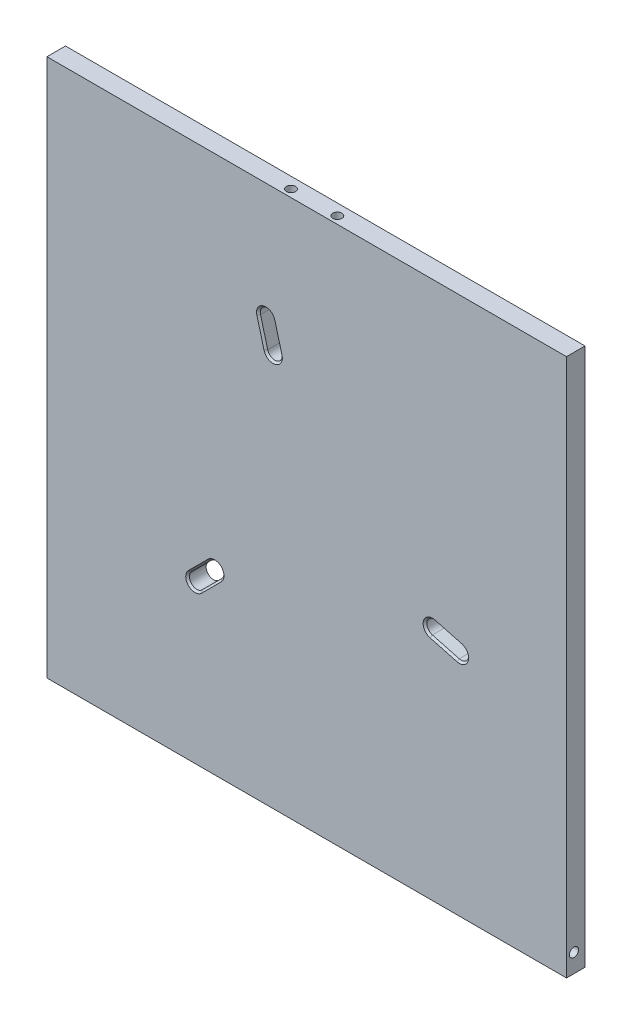
ISO-10303-21;
HEADER;
FILE_DESCRIPTION(('STEP AP214'),'2;1');
FILE_NAME('part.step','',(''),(''),'','','');
FILE_SCHEMA(('AUTOMOTIVE_DESIGN { 1 0 10303 214 1 1 1 1 }'));
ENDSEC;
DATA;
#1=APPLICATION_CONTEXT('core data for automotive mechanical design processes');
#2=APPLICATION_PROTOCOL_DEFINITION('international standard','automotive_design',2000,#1);
#3=PRODUCT_CONTEXT('',#1,'mechanical');
#4=PRODUCT('Part','Part','',(#3));
#5=PRODUCT_RELATED_PRODUCT_CATEGORY('part','',(#4));
#6=PRODUCT_DEFINITION_FORMATION('','',#4);
#7=PRODUCT_DEFINITION_CONTEXT('part definition',#1,'design');
#8=PRODUCT_DEFINITION('design','',#6,#7);
#9=PRODUCT_DEFINITION_SHAPE('','',#8);
#10=(LENGTH_UNIT() NAMED_UNIT(*) SI_UNIT(.MILLI.,.METRE.));
#11=(NAMED_UNIT(*) PLANE_ANGLE_UNIT() SI_UNIT($,.RADIAN.));
#12=(NAMED_UNIT(*) SI_UNIT($,.STERADIAN.) SOLID_ANGLE_UNIT());
#13=UNCERTAINTY_MEASURE_WITH_UNIT(LENGTH_MEASURE(1.E-05),#10,'distance_accuracy_value','');
#14=(GEOMETRIC_REPRESENTATION_CONTEXT(3) GLOBAL_UNCERTAINTY_ASSIGNED_CONTEXT((#13)) GLOBAL_UNIT_ASSIGNED_CONTEXT((#10,
#11,#12)) REPRESENTATION_CONTEXT('',''));
#15=CARTESIAN_POINT('',(0.,0.,0.));
#16=DIRECTION('',(0.,0.,1.));
#17=DIRECTION('',(1.,0.,0.));
#18=AXIS2_PLACEMENT_3D('',#15,#16,#17);
#19=CARTESIAN_POINT('',(0.,0.,0.));
#20=DIRECTION('',(0.,0.,1.));
#21=DIRECTION('',(1.,0.,0.));
#22=AXIS2_PLACEMENT_3D('',#19,#20,#21);
#23=PLANE('',#22);
#24=DIRECTION('',(-0.258819045102521,0.965925826289068,0.));
#25=VECTOR('',#24,1.);
#26=CARTESIAN_POINT('',(-7.15496283014528,42.1574980289941,0.));
#27=LINE('',#26,#25);
#28=CARTESIAN_POINT('',(-14.291343288909,68.7908324832421,0.));
#29=VERTEX_POINT('',#28);
#30=CARTESIAN_POINT('',(-18.1736289654468,83.2797198775781,0.));
#31=VERTEX_POINT('',#30);
#32=EDGE_CURVE('E332',#29,#31,#27,.T.);
#33=ORIENTED_EDGE('',*,*,#32,.T.);
#34=CARTESIAN_POINT('',(-22.0373322706031,82.244443697168,0.));
#35=DIRECTION('',(0.,0.,1.));
#36=DIRECTION('',(0.965925826289068,0.25881904510252,0.));
#37=AXIS2_PLACEMENT_3D('',#34,#35,#36);
#38=CIRCLE('',#37,4.);
#39=CARTESIAN_POINT('',(-25.9010355757594,81.2091675167579,0.));
#40=VERTEX_POINT('',#39);
#41=EDGE_CURVE('E336',#31,#40,#38,.T.);
#42=ORIENTED_EDGE('',*,*,#41,.T.);
#43=DIRECTION('',(0.258819045102521,-0.965925826289068,0.));
#44=VECTOR('',#43,1.);
#45=CARTESIAN_POINT('',(-12.9412266021889,32.8425019710059,0.));
#46=LINE('',#45,#44);
#47=CARTESIAN_POINT('',(-22.0187498992216,66.7202801224219,0.));
#48=VERTEX_POINT('',#47);
#49=EDGE_CURVE('E21',#40,#48,#46,.T.);
#50=ORIENTED_EDGE('',*,*,#49,.T.);
#51=CARTESIAN_POINT('',(-18.1550465940653,67.755556302832,0.));
#52=DIRECTION('',(0.,0.,1.));
#53=DIRECTION('',(-0.965925826289068,-0.258819045102521,0.));
#54=AXIS2_PLACEMENT_3D('',#51,#52,#53);
#55=CIRCLE('',#54,4.);
#56=EDGE_CURVE('E278',#48,#29,#55,.T.);
#57=ORIENTED_EDGE('',*,*,#56,.T.);
#58=EDGE_LOOP('',(#33,#42,#50,#57));
#59=FACE_BOUND('',#58,.T.);
#60=DIRECTION('',(-0.707106781186547,-0.707106781186548,0.));
#61=VECTOR('',#60,1.);
#62=CARTESIAN_POINT('',(-32.9319828380286,-27.2751285885362,0.));
#63=LINE('',#62,#61);
#64=CARTESIAN_POINT('',(-52.4289368335129,-46.7720825840205,0.));
#65=VERTEX_POINT('',#64);
#66=CARTESIAN_POINT('',(-63.0355385513111,-57.3786843018187,0.));
#67=VERTEX_POINT('',#66);
#68=EDGE_CURVE('E321',#65,#67,#63,.T.);
#69=ORIENTED_EDGE('',*,*,#68,.T.);
#70=CARTESIAN_POINT('',(-60.2071114265649,-60.2071114265649,0.));
#71=DIRECTION('',(0.,0.,1.));
#72=DIRECTION('',(-0.707106781186547,0.707106781186548,0.));
#73=AXIS2_PLACEMENT_3D('',#70,#71,#72);
#74=CIRCLE('',#73,4.);
#75=CARTESIAN_POINT('',(-57.3786843018187,-63.0355385513111,0.));
#76=VERTEX_POINT('',#75);
#77=EDGE_CURVE('E312',#67,#76,#74,.T.);
#78=ORIENTED_EDGE('',*,*,#77,.T.);
#79=DIRECTION('',(0.707106781186547,0.707106781186548,0.));
#80=VECTOR('',#79,1.);
#81=CARTESIAN_POINT('',(-21.9718277296372,-27.6286819791295,0.));
#82=LINE('',#81,#80);
#83=CARTESIAN_POINT('',(-46.7720825840205,-52.4289368335129,0.));
#84=VERTEX_POINT('',#83);
#85=EDGE_CURVE('E348',#76,#84,#82,.T.);
#86=ORIENTED_EDGE('',*,*,#85,.T.);
#87=CARTESIAN_POINT('',(-49.6005097087667,-49.6005097087667,0.));
#88=DIRECTION('',(0.,0.,1.));
#89=DIRECTION('',(0.707106781186548,-0.707106781186547,0.));
#90=AXIS2_PLACEMENT_3D('',#87,#88,#89);
#91=CIRCLE('',#90,4.);
#92=EDGE_CURVE('E358',#84,#65,#91,.T.);
#93=ORIENTED_EDGE('',*,*,#92,.T.);
#94=EDGE_LOOP('',(#69,#78,#86,#93));
#95=FACE_BOUND('',#94,.T.);
#96=DIRECTION('',(0.965925826289068,-0.258819045102521,0.));
#97=VECTOR('',#96,1.);
#98=CARTESIAN_POINT('',(40.0869456681739,-14.8823694404579,0.));
#99=LINE('',#98,#97);
#100=CARTESIAN_POINT('',(66.7202801224219,-22.0187498992216,0.));
#101=VERTEX_POINT('',#100);
#102=CARTESIAN_POINT('',(81.2091675167579,-25.9010355757594,0.));
#103=VERTEX_POINT('',#102);
#104=EDGE_CURVE('E150',#101,#103,#99,.T.);
#105=ORIENTED_EDGE('',*,*,#104,.T.);
#106=CARTESIAN_POINT('',(82.244443697168,-22.0373322706031,0.));
#107=DIRECTION('',(0.,0.,1.));
#108=DIRECTION('',(-0.258819045102522,-0.965925826289068,0.));
#109=AXIS2_PLACEMENT_3D('',#106,#107,#108);
#110=CIRCLE('',#109,4.);
#111=CARTESIAN_POINT('',(83.2797198775781,-18.1736289654469,0.));
#112=VERTEX_POINT('',#111);
#113=EDGE_CURVE('E164',#103,#112,#110,.T.);
#114=ORIENTED_EDGE('',*,*,#113,.T.);
#115=DIRECTION('',(-0.965925826289068,0.258819045102521,0.));
#116=VECTOR('',#115,1.);
#117=CARTESIAN_POINT('',(34.9130543318261,-5.2138199918764,0.));
#118=LINE('',#117,#116);
#119=CARTESIAN_POINT('',(68.7908324832421,-14.291343288909,0.));
#120=VERTEX_POINT('',#119);
#121=EDGE_CURVE('E367',#112,#120,#118,.T.);
#122=ORIENTED_EDGE('',*,*,#121,.T.);
#123=CARTESIAN_POINT('',(67.755556302832,-18.1550465940653,0.));
#124=DIRECTION('',(0.,0.,1.));
#125=DIRECTION('',(0.258819045102521,0.965925826289068,0.));
#126=AXIS2_PLACEMENT_3D('',#123,#124,#125);
#127=CIRCLE('',#126,4.);
#128=EDGE_CURVE('E602',#120,#101,#127,.T.);
#129=ORIENTED_EDGE('',*,*,#128,.T.);
#130=EDGE_LOOP('',(#105,#114,#122,#129));
#131=FACE_BOUND('',#130,.T.);
#132=DIRECTION('',(1.,0.,0.));
#133=VECTOR('',#132,1.);
#134=CARTESIAN_POINT('',(-140.,145.,0.));
#135=LINE('',#134,#133);
#136=CARTESIAN_POINT('',(-140.,145.,0.));
#137=VERTEX_POINT('',#136);
#138=CARTESIAN_POINT('',(140.,145.,0.));
#139=VERTEX_POINT('',#138);
#140=EDGE_CURVE('E11',#137,#139,#135,.T.);
#141=ORIENTED_EDGE('',*,*,#140,.T.);
#142=DIRECTION('',(0.,-1.,0.));
#143=VECTOR('',#142,1.);
#144=CARTESIAN_POINT('',(140.,145.,0.));
#145=LINE('',#144,#143);
#146=CARTESIAN_POINT('',(140.,-145.,0.));
#147=VERTEX_POINT('',#146);
#148=EDGE_CURVE('E435',#139,#147,#145,.T.);
#149=ORIENTED_EDGE('',*,*,#148,.T.);
#150=DIRECTION('',(-1.,0.,0.));
#151=VECTOR('',#150,1.);
#152=CARTESIAN_POINT('',(140.,-145.,0.));
#153=LINE('',#152,#151);
#154=CARTESIAN_POINT('',(-140.,-145.,0.));
#155=VERTEX_POINT('',#154);
#156=EDGE_CURVE('E445',#147,#155,#153,.T.);
#157=ORIENTED_EDGE('',*,*,#156,.T.);
#158=DIRECTION('',(0.,1.,0.));
#159=VECTOR('',#158,1.);
#160=CARTESIAN_POINT('',(-140.,-145.,0.));
#161=LINE('',#160,#159);
#162=EDGE_CURVE('E50',#155,#137,#161,.T.);
#163=ORIENTED_EDGE('',*,*,#162,.T.);
#164=EDGE_LOOP('',(#141,#149,#157,#163));
#165=FACE_BOUND('',#164,.T.);
#166=ADVANCED_FACE('F17',(#59,#95,#131,#165),#23,.F.);
#167=CARTESIAN_POINT('',(140.,145.,0.));
#168=DIRECTION('',(0.,1.,0.));
#169=DIRECTION('',(1.,0.,0.));
#170=AXIS2_PLACEMENT_3D('',#167,#168,#169);
#171=PLANE('',#170);
#172=CARTESIAN_POINT('',(-12.5,145.,6.));
#173=DIRECTION('',(0.,-1.,0.));
#174=DIRECTION('',(1.,0.,0.));
#175=AXIS2_PLACEMENT_3D('',#172,#173,#174);
#176=CIRCLE('',#175,2.4585);
#177=CARTESIAN_POINT('',(-14.9585,145.,6.));
#178=VERTEX_POINT('',#177);
#179=EDGE_CURVE('E371',#178,#178,#176,.T.);
#180=ORIENTED_EDGE('',*,*,#179,.T.);
#181=EDGE_LOOP('',(#180));
#182=FACE_BOUND('',#181,.T.);
#183=CARTESIAN_POINT('',(12.5,145.,6.));
#184=DIRECTION('',(0.,-1.,0.));
#185=DIRECTION('',(1.,0.,0.));
#186=AXIS2_PLACEMENT_3D('',#183,#184,#185);
#187=CIRCLE('',#186,2.4585);
#188=CARTESIAN_POINT('',(10.0415,145.,6.));
#189=VERTEX_POINT('',#188);
#190=EDGE_CURVE('E372',#189,#189,#187,.T.);
#191=ORIENTED_EDGE('',*,*,#190,.T.);
#192=EDGE_LOOP('',(#191));
#193=FACE_BOUND('',#192,.T.);
#194=ORIENTED_EDGE('',*,*,#140,.F.);
#195=DIRECTION('',(0.,0.,1.));
#196=VECTOR('',#195,1.);
#197=CARTESIAN_POINT('',(-140.,145.,0.));
#198=LINE('',#197,#196);
#199=CARTESIAN_POINT('',(-140.,145.,10.));
#200=VERTEX_POINT('',#199);
#201=EDGE_CURVE('E27',#137,#200,#198,.T.);
#202=ORIENTED_EDGE('',*,*,#201,.T.);
#203=DIRECTION('',(-1.,0.,0.));
#204=VECTOR('',#203,1.);
#205=CARTESIAN_POINT('',(-140.,145.,10.));
#206=LINE('',#205,#204);
#207=CARTESIAN_POINT('',(140.,145.,10.));
#208=VERTEX_POINT('',#207);
#209=EDGE_CURVE('E343',#208,#200,#206,.T.);
#210=ORIENTED_EDGE('',*,*,#209,.F.);
#211=DIRECTION('',(0.,0.,1.));
#212=VECTOR('',#211,1.);
#213=CARTESIAN_POINT('',(140.,145.,0.));
#214=LINE('',#213,#212);
#215=EDGE_CURVE('E432',#139,#208,#214,.T.);
#216=ORIENTED_EDGE('',*,*,#215,.F.);
#217=EDGE_LOOP('',(#194,#202,#210,#216));
#218=FACE_BOUND('',#217,.T.);
#219=ADVANCED_FACE('F649',(#182,#193,#218),#171,.T.);
#220=CARTESIAN_POINT('',(-140.,145.,0.));
#221=DIRECTION('',(-1.,0.,0.));
#222=DIRECTION('',(0.,0.,1.));
#223=AXIS2_PLACEMENT_3D('',#220,#221,#222);
#224=PLANE('',#223);
#225=CARTESIAN_POINT('',(-140.,-135.,6.));
#226=DIRECTION('',(1.,0.,0.));
#227=DIRECTION('',(0.,0.,-1.));
#228=AXIS2_PLACEMENT_3D('',#225,#226,#227);
#229=CIRCLE('',#228,2.4585);
#230=CARTESIAN_POINT('',(-140.,-135.,8.4585));
#231=VERTEX_POINT('',#230);
#232=EDGE_CURVE('E399',#231,#231,#229,.T.);
#233=ORIENTED_EDGE('',*,*,#232,.T.);
#234=EDGE_LOOP('',(#233));
#235=FACE_BOUND('',#234,.T.);
#236=ORIENTED_EDGE('',*,*,#162,.F.);
#237=DIRECTION('',(0.,0.,1.));
#238=VECTOR('',#237,1.);
#239=CARTESIAN_POINT('',(-140.,-145.,0.));
#240=LINE('',#239,#238);
#241=CARTESIAN_POINT('',(-140.,-145.,10.));
#242=VERTEX_POINT('',#241);
#243=EDGE_CURVE('E437',#155,#242,#240,.T.);
#244=ORIENTED_EDGE('',*,*,#243,.T.);
#245=DIRECTION('',(0.,-1.,0.));
#246=VECTOR('',#245,1.);
#247=CARTESIAN_POINT('',(-140.,-145.,10.));
#248=LINE('',#247,#246);
#249=EDGE_CURVE('E338',#200,#242,#248,.T.);
#250=ORIENTED_EDGE('',*,*,#249,.F.);
#251=ORIENTED_EDGE('',*,*,#201,.F.);
#252=EDGE_LOOP('',(#236,#244,#250,#251));
#253=FACE_BOUND('',#252,.T.);
#254=ADVANCED_FACE('F651',(#235,#253),#224,.T.);
#255=CARTESIAN_POINT('',(-140.,-145.,0.));
#256=DIRECTION('',(0.,-1.,0.));
#257=DIRECTION('',(0.,0.,-1.));
#258=AXIS2_PLACEMENT_3D('',#255,#256,#257);
#259=PLANE('',#258);
#260=ORIENTED_EDGE('',*,*,#156,.F.);
#261=DIRECTION('',(0.,0.,1.));
#262=VECTOR('',#261,1.);
#263=CARTESIAN_POINT('',(140.,-145.,0.));
#264=LINE('',#263,#262);
#265=CARTESIAN_POINT('',(140.,-145.,10.));
#266=VERTEX_POINT('',#265);
#267=EDGE_CURVE('E434',#147,#266,#264,.T.);
#268=ORIENTED_EDGE('',*,*,#267,.T.);
#269=DIRECTION('',(1.,0.,0.));
#270=VECTOR('',#269,1.);
#271=CARTESIAN_POINT('',(140.,-145.,10.));
#272=LINE('',#271,#270);
#273=EDGE_CURVE('E342',#242,#266,#272,.T.);
#274=ORIENTED_EDGE('',*,*,#273,.F.);
#275=ORIENTED_EDGE('',*,*,#243,.F.);
#276=EDGE_LOOP('',(#260,#268,#274,#275));
#277=FACE_BOUND('',#276,.T.);
#278=ADVANCED_FACE('F659',(#277),#259,.T.);
#279=CARTESIAN_POINT('',(140.,-145.,0.));
#280=DIRECTION('',(1.,0.,0.));
#281=DIRECTION('',(0.,1.,0.));
#282=AXIS2_PLACEMENT_3D('',#279,#280,#281);
#283=PLANE('',#282);
#284=CARTESIAN_POINT('',(140.,-135.,6.));
#285=DIRECTION('',(-1.,0.,0.));
#286=DIRECTION('',(0.,0.,-1.));
#287=AXIS2_PLACEMENT_3D('',#284,#285,#286);
#288=CIRCLE('',#287,2.4585);
#289=CARTESIAN_POINT('',(140.,-135.,8.4585));
#290=VERTEX_POINT('',#289);
#291=EDGE_CURVE('E381',#290,#290,#288,.T.);
#292=ORIENTED_EDGE('',*,*,#291,.T.);
#293=EDGE_LOOP('',(#292));
#294=FACE_BOUND('',#293,.T.);
#295=ORIENTED_EDGE('',*,*,#148,.F.);
#296=ORIENTED_EDGE('',*,*,#215,.T.);
#297=DIRECTION('',(0.,1.,0.));
#298=VECTOR('',#297,1.);
#299=CARTESIAN_POINT('',(140.,145.,10.));
#300=LINE('',#299,#298);
#301=EDGE_CURVE('E598',#266,#208,#300,.T.);
#302=ORIENTED_EDGE('',*,*,#301,.F.);
#303=ORIENTED_EDGE('',*,*,#267,.F.);
#304=EDGE_LOOP('',(#295,#296,#302,#303));
#305=FACE_BOUND('',#304,.T.);
#306=ADVANCED_FACE('F693',(#294,#305),#283,.T.);
#307=CARTESIAN_POINT('',(-22.0373322706031,82.244443697168,10.));
#308=DIRECTION('',(0.,0.,-1.));
#309=DIRECTION('',(0.965925826289068,0.25881904510252,0.));
#310=AXIS2_PLACEMENT_3D('',#307,#308,#309);
#311=CYLINDRICAL_SURFACE('',#310,4.);
#312=CARTESIAN_POINT('',(-22.0373322706031,82.244443697168,9.));
#313=DIRECTION('',(0.,0.,-1.));
#314=DIRECTION('',(0.965925826289068,0.25881904510252,0.));
#315=AXIS2_PLACEMENT_3D('',#312,#313,#314);
#316=CIRCLE('',#315,4.);
#317=CARTESIAN_POINT('',(-25.9010355757594,81.2091675167579,9.));
#318=VERTEX_POINT('',#317);
#319=CARTESIAN_POINT('',(-18.1736289654468,83.2797198775781,9.));
#320=VERTEX_POINT('',#319);
#321=EDGE_CURVE('E501',#318,#320,#316,.T.);
#322=ORIENTED_EDGE('',*,*,#321,.F.);
#323=DIRECTION('',(0.,0.,-1.));
#324=VECTOR('',#323,1.);
#325=CARTESIAN_POINT('',(-25.9010355757594,81.2091675167579,10.));
#326=LINE('',#325,#324);
#327=EDGE_CURVE('E289',#318,#40,#326,.T.);
#328=ORIENTED_EDGE('',*,*,#327,.T.);
#329=ORIENTED_EDGE('',*,*,#41,.F.);
#330=DIRECTION('',(0.,0.,-1.));
#331=VECTOR('',#330,1.);
#332=CARTESIAN_POINT('',(-18.1736289654468,83.2797198775781,10.));
#333=LINE('',#332,#331);
#334=EDGE_CURVE('E337',#320,#31,#333,.T.);
#335=ORIENTED_EDGE('',*,*,#334,.F.);
#336=EDGE_LOOP('',(#322,#328,#329,#335));
#337=FACE_BOUND('',#336,.T.);
#338=ADVANCED_FACE('F698',(#337),#311,.F.);
#339=CARTESIAN_POINT('',(-18.1736289654468,83.2797198775781,10.));
#340=DIRECTION('',(0.965925826289068,0.258819045102521,0.));
#341=DIRECTION('',(0.,0.,-1.));
#342=AXIS2_PLACEMENT_3D('',#339,#340,#341);
#343=PLANE('',#342);
#344=DIRECTION('',(0.258819045102521,-0.965925826289068,0.));
#345=VECTOR('',#344,1.);
#346=CARTESIAN_POINT('',(-7.15496283014528,42.1574980289941,9.));
#347=LINE('',#346,#345);
#348=CARTESIAN_POINT('',(-14.291343288909,68.7908324832421,9.));
#349=VERTEX_POINT('',#348);
#350=EDGE_CURVE('E283',#320,#349,#347,.T.);
#351=ORIENTED_EDGE('',*,*,#350,.F.);
#352=ORIENTED_EDGE('',*,*,#334,.T.);
#353=ORIENTED_EDGE('',*,*,#32,.F.);
#354=DIRECTION('',(0.,0.,-1.));
#355=VECTOR('',#354,1.);
#356=CARTESIAN_POINT('',(-14.291343288909,68.7908324832421,10.));
#357=LINE('',#356,#355);
#358=EDGE_CURVE('E429',#349,#29,#357,.T.);
#359=ORIENTED_EDGE('',*,*,#358,.F.);
#360=EDGE_LOOP('',(#351,#352,#353,#359));
#361=FACE_BOUND('',#360,.T.);
#362=ADVANCED_FACE('F812',(#361),#343,.F.);
#363=CARTESIAN_POINT('',(-18.1550465940653,67.755556302832,10.));
#364=DIRECTION('',(0.,0.,-1.));
#365=DIRECTION('',(-0.965925826289068,-0.258819045102521,0.));
#366=AXIS2_PLACEMENT_3D('',#363,#364,#365);
#367=CYLINDRICAL_SURFACE('',#366,4.);
#368=CARTESIAN_POINT('',(-18.1550465940653,67.755556302832,9.));
#369=DIRECTION('',(0.,0.,-1.));
#370=DIRECTION('',(-0.965925826289068,-0.258819045102521,0.));
#371=AXIS2_PLACEMENT_3D('',#368,#369,#370);
#372=CIRCLE('',#371,4.);
#373=CARTESIAN_POINT('',(-22.0187498992216,66.7202801224219,9.));
#374=VERTEX_POINT('',#373);
#375=EDGE_CURVE('E275',#349,#374,#372,.T.);
#376=ORIENTED_EDGE('',*,*,#375,.F.);
#377=ORIENTED_EDGE('',*,*,#358,.T.);
#378=ORIENTED_EDGE('',*,*,#56,.F.);
#379=DIRECTION('',(0.,0.,-1.));
#380=VECTOR('',#379,1.);
#381=CARTESIAN_POINT('',(-22.0187498992216,66.7202801224219,10.));
#382=LINE('',#381,#380);
#383=EDGE_CURVE('E270',#374,#48,#382,.T.);
#384=ORIENTED_EDGE('',*,*,#383,.F.);
#385=EDGE_LOOP('',(#376,#377,#378,#384));
#386=FACE_BOUND('',#385,.T.);
#387=ADVANCED_FACE('F272',(#386),#367,.F.);
#388=CARTESIAN_POINT('',(-22.0187498992216,66.7202801224219,10.));
#389=DIRECTION('',(-0.965925826289068,-0.258819045102521,0.));
#390=DIRECTION('',(-0.258819045102521,0.965925826289068,0.));
#391=AXIS2_PLACEMENT_3D('',#388,#389,#390);
#392=PLANE('',#391);
#393=DIRECTION('',(-0.258819045102521,0.965925826289068,0.));
#394=VECTOR('',#393,1.);
#395=CARTESIAN_POINT('',(-12.9412266021889,32.8425019710059,9.));
#396=LINE('',#395,#394);
#397=EDGE_CURVE('E286',#374,#318,#396,.T.);
#398=ORIENTED_EDGE('',*,*,#397,.F.);
#399=ORIENTED_EDGE('',*,*,#383,.T.);
#400=ORIENTED_EDGE('',*,*,#49,.F.);
#401=ORIENTED_EDGE('',*,*,#327,.F.);
#402=EDGE_LOOP('',(#398,#399,#400,#401));
#403=FACE_BOUND('',#402,.T.);
#404=ADVANCED_FACE('F287',(#403),#392,.F.);
#405=CARTESIAN_POINT('',(-6.67199991700075,42.2869075515453,9.5));
#406=DIRECTION('',(-0.683012701892218,-0.183012701892219,0.707106781186549));
#407=DIRECTION('',(-0.258819045102521,0.965925826289068,0.));
#408=AXIS2_PLACEMENT_3D('',#405,#406,#407);
#409=PLANE('',#408);
#410=DIRECTION('',(-0.683012701892217,-0.183012701892223,-0.707106781186549));
#411=VECTOR('',#410,1.);
#412=CARTESIAN_POINT('',(-13.32541746262,69.0496515283446,10.));
#413=LINE('',#412,#411);
#414=CARTESIAN_POINT('',(-13.32541746262,69.0496515283446,10.));
#415=VERTEX_POINT('',#414);
#416=EDGE_CURVE('E304',#415,#349,#413,.T.);
#417=ORIENTED_EDGE('',*,*,#416,.F.);
#418=DIRECTION('',(-0.258819045102521,0.965925826289068,0.));
#419=VECTOR('',#418,1.);
#420=CARTESIAN_POINT('',(-6.18903700385621,42.4163170740966,10.));
#421=LINE('',#420,#419);
#422=CARTESIAN_POINT('',(-17.2077031391578,83.5385389226806,10.));
#423=VERTEX_POINT('',#422);
#424=EDGE_CURVE('E363',#415,#423,#421,.T.);
#425=ORIENTED_EDGE('',*,*,#424,.T.);
#426=DIRECTION('',(0.683012701892214,0.183012701892218,0.707106781186553));
#427=VECTOR('',#426,1.);
#428=CARTESIAN_POINT('',(-18.1736289654468,83.2797198775781,9.));
#429=LINE('',#428,#427);
#430=EDGE_CURVE('E296',#320,#423,#429,.T.);
#431=ORIENTED_EDGE('',*,*,#430,.F.);
#432=ORIENTED_EDGE('',*,*,#350,.T.);
#433=EDGE_LOOP('',(#417,#425,#431,#432));
#434=FACE_BOUND('',#433,.T.);
#435=ADVANCED_FACE('F672',(#434),#409,.T.);
#436=CARTESIAN_POINT('',(-22.0373322706031,82.244443697168,9.5));
#437=DIRECTION('',(0.,0.,1.));
#438=DIRECTION('',(0.965925826289068,0.25881904510252,0.));
#439=AXIS2_PLACEMENT_3D('',#436,#437,#438);
#440=CONICAL_SURFACE('',#439,4.5,0.785398163397445);
#441=ORIENTED_EDGE('',*,*,#430,.T.);
#442=CARTESIAN_POINT('',(-22.0373322706031,82.244443697168,10.));
#443=DIRECTION('',(0.,0.,1.));
#444=DIRECTION('',(0.965925826289068,0.25881904510252,0.));
#445=AXIS2_PLACEMENT_3D('',#442,#443,#444);
#446=CIRCLE('',#445,5.);
#447=CARTESIAN_POINT('',(-26.8669614020485,80.9503484716554,10.));
#448=VERTEX_POINT('',#447);
#449=EDGE_CURVE('E518',#423,#448,#446,.T.);
#450=ORIENTED_EDGE('',*,*,#449,.T.);
#451=DIRECTION('',(-0.683012701892219,-0.183012701892216,0.707106781186549));
#452=VECTOR('',#451,1.);
#453=CARTESIAN_POINT('',(-25.9010355757594,81.2091675167579,9.));
#454=LINE('',#453,#452);
#455=EDGE_CURVE('E297',#318,#448,#454,.T.);
#456=ORIENTED_EDGE('',*,*,#455,.F.);
#457=ORIENTED_EDGE('',*,*,#321,.T.);
#458=EDGE_LOOP('',(#441,#450,#456,#457));
#459=FACE_BOUND('',#458,.T.);
#460=ADVANCED_FACE('F553',(#459),#440,.F.);
#461=CARTESIAN_POINT('',(-13.4241895153334,32.7130924484547,9.5));
#462=DIRECTION('',(0.68301270189222,0.18301270189222,0.707106781186547));
#463=DIRECTION('',(0.258819045102522,-0.965925826289068,0.));
#464=AXIS2_PLACEMENT_3D('',#461,#462,#463);
#465=PLANE('',#464);
#466=ORIENTED_EDGE('',*,*,#455,.T.);
#467=DIRECTION('',(0.258819045102521,-0.965925826289068,0.));
#468=VECTOR('',#467,1.);
#469=CARTESIAN_POINT('',(-13.907152428478,32.5836829259034,10.));
#470=LINE('',#469,#468);
#471=CARTESIAN_POINT('',(-22.9846757255107,66.4614610773194,10.));
#472=VERTEX_POINT('',#471);
#473=EDGE_CURVE('E309',#448,#472,#470,.T.);
#474=ORIENTED_EDGE('',*,*,#473,.T.);
#475=DIRECTION('',(-0.683012701892224,-0.183012701892221,0.707106781186543));
#476=VECTOR('',#475,1.);
#477=CARTESIAN_POINT('',(-22.0187498992216,66.7202801224219,9.));
#478=LINE('',#477,#476);
#479=EDGE_CURVE('E302',#374,#472,#478,.T.);
#480=ORIENTED_EDGE('',*,*,#479,.F.);
#481=ORIENTED_EDGE('',*,*,#397,.T.);
#482=EDGE_LOOP('',(#466,#474,#480,#481));
#483=FACE_BOUND('',#482,.T.);
#484=ADVANCED_FACE('F307',(#483),#465,.T.);
#485=CARTESIAN_POINT('',(-18.1550465940653,67.755556302832,9.5));
#486=DIRECTION('',(0.,0.,1.));
#487=DIRECTION('',(-0.965925826289068,-0.258819045102521,0.));
#488=AXIS2_PLACEMENT_3D('',#485,#486,#487);
#489=CONICAL_SURFACE('',#488,4.5,0.78539816339745);
#490=ORIENTED_EDGE('',*,*,#479,.T.);
#491=CARTESIAN_POINT('',(-18.1550465940653,67.755556302832,10.));
#492=DIRECTION('',(0.,0.,1.));
#493=DIRECTION('',(-0.965925826289068,-0.258819045102521,0.));
#494=AXIS2_PLACEMENT_3D('',#491,#492,#493);
#495=CIRCLE('',#494,5.);
#496=EDGE_CURVE('E519',#472,#415,#495,.T.);
#497=ORIENTED_EDGE('',*,*,#496,.T.);
#498=ORIENTED_EDGE('',*,*,#416,.T.);
#499=ORIENTED_EDGE('',*,*,#375,.T.);
#500=EDGE_LOOP('',(#490,#497,#498,#499));
#501=FACE_BOUND('',#500,.T.);
#502=ADVANCED_FACE('F300',(#501),#489,.F.);
#503=CARTESIAN_POINT('',(-60.2071114265649,-60.2071114265649,10.));
#504=DIRECTION('',(0.,0.,-1.));
#505=DIRECTION('',(-0.707106781186547,0.707106781186548,0.));
#506=AXIS2_PLACEMENT_3D('',#503,#504,#505);
#507=CYLINDRICAL_SURFACE('',#506,4.);
#508=CARTESIAN_POINT('',(-60.2071114265649,-60.2071114265649,9.));
#509=DIRECTION('',(0.,0.,-1.));
#510=DIRECTION('',(-0.707106781186547,0.707106781186548,0.));
#511=AXIS2_PLACEMENT_3D('',#508,#509,#510);
#512=CIRCLE('',#511,4.);
#513=CARTESIAN_POINT('',(-57.3786843018187,-63.0355385513111,9.));
#514=VERTEX_POINT('',#513);
#515=CARTESIAN_POINT('',(-63.0355385513111,-57.3786843018187,9.));
#516=VERTEX_POINT('',#515);
#517=EDGE_CURVE('E531',#514,#516,#512,.T.);
#518=ORIENTED_EDGE('',*,*,#517,.F.);
#519=DIRECTION('',(0.,0.,-1.));
#520=VECTOR('',#519,1.);
#521=CARTESIAN_POINT('',(-57.3786843018187,-63.0355385513111,10.));
#522=LINE('',#521,#520);
#523=EDGE_CURVE('E353',#514,#76,#522,.T.);
#524=ORIENTED_EDGE('',*,*,#523,.T.);
#525=ORIENTED_EDGE('',*,*,#77,.F.);
#526=DIRECTION('',(0.,0.,-1.));
#527=VECTOR('',#526,1.);
#528=CARTESIAN_POINT('',(-63.0355385513111,-57.3786843018187,10.));
#529=LINE('',#528,#527);
#530=EDGE_CURVE('E542',#516,#67,#529,.T.);
#531=ORIENTED_EDGE('',*,*,#530,.F.);
#532=EDGE_LOOP('',(#518,#524,#525,#531));
#533=FACE_BOUND('',#532,.T.);
#534=ADVANCED_FACE('F19',(#533),#507,.F.);
#535=CARTESIAN_POINT('',(-63.0355385513111,-57.3786843018187,10.));
#536=DIRECTION('',(-0.707106781186548,0.707106781186547,0.));
#537=DIRECTION('',(0.,0.,1.));
#538=AXIS2_PLACEMENT_3D('',#535,#536,#537);
#539=PLANE('',#538);
#540=DIRECTION('',(0.707106781186547,0.707106781186548,0.));
#541=VECTOR('',#540,1.);
#542=CARTESIAN_POINT('',(-32.9319828380286,-27.2751285885362,9.));
#543=LINE('',#542,#541);
#544=CARTESIAN_POINT('',(-52.4289368335129,-46.7720825840205,9.));
#545=VERTEX_POINT('',#544);
#546=EDGE_CURVE('E349',#516,#545,#543,.T.);
#547=ORIENTED_EDGE('',*,*,#546,.F.);
#548=ORIENTED_EDGE('',*,*,#530,.T.);
#549=ORIENTED_EDGE('',*,*,#68,.F.);
#550=DIRECTION('',(0.,0.,-1.));
#551=VECTOR('',#550,1.);
#552=CARTESIAN_POINT('',(-52.4289368335129,-46.7720825840205,10.));
#553=LINE('',#552,#551);
#554=EDGE_CURVE('E354',#545,#65,#553,.T.);
#555=ORIENTED_EDGE('',*,*,#554,.F.);
#556=EDGE_LOOP('',(#547,#548,#549,#555));
#557=FACE_BOUND('',#556,.T.);
#558=ADVANCED_FACE('F729',(#557),#539,.F.);
#559=CARTESIAN_POINT('',(82.244443697168,-22.0373322706031,10.));
#560=DIRECTION('',(0.,0.,-1.));
#561=DIRECTION('',(-0.258819045102522,-0.965925826289068,0.));
#562=AXIS2_PLACEMENT_3D('',#559,#560,#561);
#563=CYLINDRICAL_SURFACE('',#562,4.);
#564=CARTESIAN_POINT('',(82.244443697168,-22.0373322706031,9.));
#565=DIRECTION('',(0.,0.,-1.));
#566=DIRECTION('',(-0.258819045102522,-0.965925826289068,0.));
#567=AXIS2_PLACEMENT_3D('',#564,#565,#566);
#568=CIRCLE('',#567,4.);
#569=CARTESIAN_POINT('',(83.2797198775781,-18.1736289654469,9.));
#570=VERTEX_POINT('',#569);
#571=CARTESIAN_POINT('',(81.2091675167579,-25.9010355757594,9.));
#572=VERTEX_POINT('',#571);
#573=EDGE_CURVE('E508',#570,#572,#568,.T.);
#574=ORIENTED_EDGE('',*,*,#573,.F.);
#575=DIRECTION('',(0.,0.,-1.));
#576=VECTOR('',#575,1.);
#577=CARTESIAN_POINT('',(83.2797198775781,-18.1736289654469,10.));
#578=LINE('',#577,#576);
#579=EDGE_CURVE('E364',#570,#112,#578,.T.);
#580=ORIENTED_EDGE('',*,*,#579,.T.);
#581=ORIENTED_EDGE('',*,*,#113,.F.);
#582=DIRECTION('',(0.,0.,-1.));
#583=VECTOR('',#582,1.);
#584=CARTESIAN_POINT('',(81.2091675167579,-25.9010355757594,10.));
#585=LINE('',#584,#583);
#586=EDGE_CURVE('E482',#572,#103,#585,.T.);
#587=ORIENTED_EDGE('',*,*,#586,.F.);
#588=EDGE_LOOP('',(#574,#580,#581,#587));
#589=FACE_BOUND('',#588,.T.);
#590=ADVANCED_FACE('F889',(#589),#563,.F.);
#591=CARTESIAN_POINT('',(81.2091675167579,-25.9010355757594,10.));
#592=DIRECTION('',(-0.258819045102521,-0.965925826289068,0.));
#593=DIRECTION('',(-0.965925826289068,0.258819045102521,0.));
#594=AXIS2_PLACEMENT_3D('',#591,#592,#593);
#595=PLANE('',#594);
#596=DIRECTION('',(-0.965925826289068,0.258819045102521,0.));
#597=VECTOR('',#596,1.);
#598=CARTESIAN_POINT('',(40.0869456681739,-14.8823694404579,9.));
#599=LINE('',#598,#597);
#600=CARTESIAN_POINT('',(66.7202801224219,-22.0187498992216,9.));
#601=VERTEX_POINT('',#600);
#602=EDGE_CURVE('E512',#572,#601,#599,.T.);
#603=ORIENTED_EDGE('',*,*,#602,.F.);
#604=ORIENTED_EDGE('',*,*,#586,.T.);
#605=ORIENTED_EDGE('',*,*,#104,.F.);
#606=DIRECTION('',(0.,0.,-1.));
#607=VECTOR('',#606,1.);
#608=CARTESIAN_POINT('',(66.7202801224219,-22.0187498992216,10.));
#609=LINE('',#608,#607);
#610=EDGE_CURVE('E366',#601,#101,#609,.T.);
#611=ORIENTED_EDGE('',*,*,#610,.F.);
#612=EDGE_LOOP('',(#603,#604,#605,#611));
#613=FACE_BOUND('',#612,.T.);
#614=ADVANCED_FACE('F690',(#613),#595,.F.);
#615=CARTESIAN_POINT('',(-49.6005097087667,-49.6005097087667,10.));
#616=DIRECTION('',(0.,0.,-1.));
#617=DIRECTION('',(0.707106781186548,-0.707106781186547,0.));
#618=AXIS2_PLACEMENT_3D('',#615,#616,#617);
#619=CYLINDRICAL_SURFACE('',#618,4.);
#620=CARTESIAN_POINT('',(-49.6005097087667,-49.6005097087667,9.));
#621=DIRECTION('',(0.,0.,-1.));
#622=DIRECTION('',(0.707106781186548,-0.707106781186547,0.));
#623=AXIS2_PLACEMENT_3D('',#620,#621,#622);
#624=CIRCLE('',#623,4.);
#625=CARTESIAN_POINT('',(-46.7720825840205,-52.4289368335129,9.));
#626=VERTEX_POINT('',#625);
#627=EDGE_CURVE('E392',#545,#626,#624,.T.);
#628=ORIENTED_EDGE('',*,*,#627,.F.);
#629=ORIENTED_EDGE('',*,*,#554,.T.);
#630=ORIENTED_EDGE('',*,*,#92,.F.);
#631=DIRECTION('',(0.,0.,-1.));
#632=VECTOR('',#631,1.);
#633=CARTESIAN_POINT('',(-46.7720825840205,-52.4289368335129,10.));
#634=LINE('',#633,#632);
#635=EDGE_CURVE('E344',#626,#84,#634,.T.);
#636=ORIENTED_EDGE('',*,*,#635,.F.);
#637=EDGE_LOOP('',(#628,#629,#630,#636));
#638=FACE_BOUND('',#637,.T.);
#639=ADVANCED_FACE('F687',(#638),#619,.F.);
#640=CARTESIAN_POINT('',(-46.7720825840205,-52.4289368335129,10.));
#641=DIRECTION('',(0.707106781186548,-0.707106781186547,0.));
#642=DIRECTION('',(0.,0.,-1.));
#643=AXIS2_PLACEMENT_3D('',#640,#641,#642);
#644=PLANE('',#643);
#645=DIRECTION('',(-0.707106781186547,-0.707106781186548,0.));
#646=VECTOR('',#645,1.);
#647=CARTESIAN_POINT('',(-21.9718277296372,-27.6286819791295,9.));
#648=LINE('',#647,#646);
#649=EDGE_CURVE('E486',#626,#514,#648,.T.);
#650=ORIENTED_EDGE('',*,*,#649,.F.);
#651=ORIENTED_EDGE('',*,*,#635,.T.);
#652=ORIENTED_EDGE('',*,*,#85,.F.);
#653=ORIENTED_EDGE('',*,*,#523,.F.);
#654=EDGE_LOOP('',(#650,#651,#652,#653));
#655=FACE_BOUND('',#654,.T.);
#656=ADVANCED_FACE('F689',(#655),#644,.F.);
#657=CARTESIAN_POINT('',(-33.2855362286219,-26.921575197943,9.5));
#658=DIRECTION('',(0.5,-0.5,0.707106781186547));
#659=DIRECTION('',(-0.707106781186548,-0.707106781186548,0.));
#660=AXIS2_PLACEMENT_3D('',#657,#658,#659);
#661=PLANE('',#660);
#662=DIRECTION('',(0.5,-0.5,-0.70710678118655));
#663=VECTOR('',#662,1.);
#664=CARTESIAN_POINT('',(-53.1360436146994,-46.064975802834,10.));
#665=LINE('',#664,#663);
#666=CARTESIAN_POINT('',(-53.1360436146994,-46.064975802834,10.));
#667=VERTEX_POINT('',#666);
#668=EDGE_CURVE('E362',#667,#545,#665,.T.);
#669=ORIENTED_EDGE('',*,*,#668,.F.);
#670=DIRECTION('',(-0.707106781186547,-0.707106781186548,0.));
#671=VECTOR('',#670,1.);
#672=CARTESIAN_POINT('',(-33.6390896192152,-26.5680218073497,10.));
#673=LINE('',#672,#671);
#674=CARTESIAN_POINT('',(-63.7426453324976,-56.6715775206322,10.));
#675=VERTEX_POINT('',#674);
#676=EDGE_CURVE('E563',#667,#675,#673,.T.);
#677=ORIENTED_EDGE('',*,*,#676,.T.);
#678=DIRECTION('',(-0.5,0.5,0.70710678118655));
#679=VECTOR('',#678,1.);
#680=CARTESIAN_POINT('',(-63.0355385513111,-57.3786843018187,9.));
#681=LINE('',#680,#679);
#682=EDGE_CURVE('E232',#516,#675,#681,.T.);
#683=ORIENTED_EDGE('',*,*,#682,.F.);
#684=ORIENTED_EDGE('',*,*,#546,.T.);
#685=EDGE_LOOP('',(#669,#677,#683,#684));
#686=FACE_BOUND('',#685,.T.);
#687=ADVANCED_FACE('F833',(#686),#661,.T.);
#688=CARTESIAN_POINT('',(-60.2071114265649,-60.2071114265649,9.5));
#689=DIRECTION('',(0.,0.,1.));
#690=DIRECTION('',(-0.707106781186547,0.707106781186548,0.));
#691=AXIS2_PLACEMENT_3D('',#688,#689,#690);
#692=CONICAL_SURFACE('',#691,4.5,0.785398163397448);
#693=ORIENTED_EDGE('',*,*,#682,.T.);
#694=CARTESIAN_POINT('',(-60.2071114265649,-60.2071114265649,10.));
#695=DIRECTION('',(0.,0.,1.));
#696=DIRECTION('',(-0.707106781186547,0.707106781186548,0.));
#697=AXIS2_PLACEMENT_3D('',#694,#695,#696);
#698=CIRCLE('',#697,5.);
#699=CARTESIAN_POINT('',(-56.6715775206322,-63.7426453324976,10.));
#700=VERTEX_POINT('',#699);
#701=EDGE_CURVE('E567',#675,#700,#698,.T.);
#702=ORIENTED_EDGE('',*,*,#701,.T.);
#703=DIRECTION('',(0.5,-0.5,0.707106781186546));
#704=VECTOR('',#703,1.);
#705=CARTESIAN_POINT('',(-57.3786843018187,-63.0355385513111,9.));
#706=LINE('',#705,#704);
#707=EDGE_CURVE('E244',#514,#700,#706,.T.);
#708=ORIENTED_EDGE('',*,*,#707,.F.);
#709=ORIENTED_EDGE('',*,*,#517,.T.);
#710=EDGE_LOOP('',(#693,#702,#708,#709));
#711=FACE_BOUND('',#710,.T.);
#712=ADVANCED_FACE('F827',(#711),#692,.F.);
#713=CARTESIAN_POINT('',(-21.6182743390439,-27.9822353697228,9.5));
#714=DIRECTION('',(-0.5,0.5,0.707106781186546));
#715=DIRECTION('',(0.707106781186548,0.707106781186548,0.));
#716=AXIS2_PLACEMENT_3D('',#713,#714,#715);
#717=PLANE('',#716);
#718=ORIENTED_EDGE('',*,*,#707,.T.);
#719=DIRECTION('',(0.707106781186547,0.707106781186548,0.));
#720=VECTOR('',#719,1.);
#721=CARTESIAN_POINT('',(-21.2647209484506,-28.3357887603161,10.));
#722=LINE('',#721,#720);
#723=CARTESIAN_POINT('',(-46.0649758028339,-53.1360436146994,10.));
#724=VERTEX_POINT('',#723);
#725=EDGE_CURVE('E575',#700,#724,#722,.T.);
#726=ORIENTED_EDGE('',*,*,#725,.T.);
#727=DIRECTION('',(0.5,-0.5,0.707106781186548));
#728=VECTOR('',#727,1.);
#729=CARTESIAN_POINT('',(-46.7720825840205,-52.4289368335129,9.));
#730=LINE('',#729,#728);
#731=EDGE_CURVE('E359',#626,#724,#730,.T.);
#732=ORIENTED_EDGE('',*,*,#731,.F.);
#733=ORIENTED_EDGE('',*,*,#649,.T.);
#734=EDGE_LOOP('',(#718,#726,#732,#733));
#735=FACE_BOUND('',#734,.T.);
#736=ADVANCED_FACE('F832',(#735),#717,.T.);
#737=CARTESIAN_POINT('',(-49.6005097087667,-49.6005097087667,9.5));
#738=DIRECTION('',(0.,0.,1.));
#739=DIRECTION('',(0.707106781186548,-0.707106781186547,0.));
#740=AXIS2_PLACEMENT_3D('',#737,#738,#739);
#741=CONICAL_SURFACE('',#740,4.5,0.785398163397448);
#742=ORIENTED_EDGE('',*,*,#731,.T.);
#743=CARTESIAN_POINT('',(-49.6005097087667,-49.6005097087667,10.));
#744=DIRECTION('',(0.,0.,1.));
#745=DIRECTION('',(0.707106781186548,-0.707106781186547,0.));
#746=AXIS2_PLACEMENT_3D('',#743,#744,#745);
#747=CIRCLE('',#746,5.);
#748=EDGE_CURVE('E615',#724,#667,#747,.T.);
#749=ORIENTED_EDGE('',*,*,#748,.T.);
#750=ORIENTED_EDGE('',*,*,#668,.T.);
#751=ORIENTED_EDGE('',*,*,#627,.T.);
#752=EDGE_LOOP('',(#742,#749,#750,#751));
#753=FACE_BOUND('',#752,.T.);
#754=ADVANCED_FACE('F842',(#753),#741,.F.);
#755=CARTESIAN_POINT('',(0.,0.,10.));
#756=DIRECTION('',(0.,0.,1.));
#757=DIRECTION('',(1.,0.,0.));
#758=AXIS2_PLACEMENT_3D('',#755,#756,#757);
#759=PLANE('',#758);
#760=CARTESIAN_POINT('',(67.755556302832,-18.1550465940653,10.));
#761=DIRECTION('',(0.,0.,1.));
#762=DIRECTION('',(0.258819045102521,0.965925826289068,0.));
#763=AXIS2_PLACEMENT_3D('',#760,#761,#762);
#764=CIRCLE('',#763,5.);
#765=CARTESIAN_POINT('',(69.0496515283446,-13.32541746262,10.));
#766=VERTEX_POINT('',#765);
#767=CARTESIAN_POINT('',(66.4614610773194,-22.9846757255107,10.));
#768=VERTEX_POINT('',#767);
#769=EDGE_CURVE('E386',#766,#768,#764,.T.);
#770=ORIENTED_EDGE('',*,*,#769,.F.);
#771=DIRECTION('',(-0.965925826289068,0.258819045102521,0.));
#772=VECTOR('',#771,1.);
#773=CARTESIAN_POINT('',(35.1718733769286,-4.24789416558733,10.));
#774=LINE('',#773,#772);
#775=CARTESIAN_POINT('',(83.5385389226806,-17.2077031391578,10.));
#776=VERTEX_POINT('',#775);
#777=EDGE_CURVE('E393',#776,#766,#774,.T.);
#778=ORIENTED_EDGE('',*,*,#777,.F.);
#779=CARTESIAN_POINT('',(82.244443697168,-22.0373322706031,10.));
#780=DIRECTION('',(0.,0.,1.));
#781=DIRECTION('',(-0.258819045102522,-0.965925826289068,0.));
#782=AXIS2_PLACEMENT_3D('',#779,#780,#781);
#783=CIRCLE('',#782,5.);
#784=CARTESIAN_POINT('',(80.9503484716554,-26.8669614020485,10.));
#785=VERTEX_POINT('',#784);
#786=EDGE_CURVE('E423',#785,#776,#783,.T.);
#787=ORIENTED_EDGE('',*,*,#786,.F.);
#788=DIRECTION('',(0.965925826289068,-0.258819045102521,0.));
#789=VECTOR('',#788,1.);
#790=CARTESIAN_POINT('',(39.8281266230714,-15.8482952667469,10.));
#791=LINE('',#790,#789);
#792=EDGE_CURVE('E516',#768,#785,#791,.T.);
#793=ORIENTED_EDGE('',*,*,#792,.F.);
#794=EDGE_LOOP('',(#770,#778,#787,#793));
#795=FACE_BOUND('',#794,.T.);
#796=ORIENTED_EDGE('',*,*,#496,.F.);
#797=ORIENTED_EDGE('',*,*,#473,.F.);
#798=ORIENTED_EDGE('',*,*,#449,.F.);
#799=ORIENTED_EDGE('',*,*,#424,.F.);
#800=EDGE_LOOP('',(#796,#797,#798,#799));
#801=FACE_BOUND('',#800,.T.);
#802=ORIENTED_EDGE('',*,*,#748,.F.);
#803=ORIENTED_EDGE('',*,*,#725,.F.);
#804=ORIENTED_EDGE('',*,*,#701,.F.);
#805=ORIENTED_EDGE('',*,*,#676,.F.);
#806=EDGE_LOOP('',(#802,#803,#804,#805));
#807=FACE_BOUND('',#806,.T.);
#808=ORIENTED_EDGE('',*,*,#209,.T.);
#809=ORIENTED_EDGE('',*,*,#249,.T.);
#810=ORIENTED_EDGE('',*,*,#273,.T.);
#811=ORIENTED_EDGE('',*,*,#301,.T.);
#812=EDGE_LOOP('',(#808,#809,#810,#811));
#813=FACE_BOUND('',#812,.T.);
#814=ADVANCED_FACE('F560',(#795,#801,#807,#813),#759,.T.);
#815=CARTESIAN_POINT('',(67.755556302832,-18.1550465940653,10.));
#816=DIRECTION('',(0.,0.,-1.));
#817=DIRECTION('',(0.258819045102521,0.965925826289068,0.));
#818=AXIS2_PLACEMENT_3D('',#815,#816,#817);
#819=CYLINDRICAL_SURFACE('',#818,4.);
#820=CARTESIAN_POINT('',(67.755556302832,-18.1550465940653,9.));
#821=DIRECTION('',(0.,0.,-1.));
#822=DIRECTION('',(0.258819045102521,0.965925826289068,0.));
#823=AXIS2_PLACEMENT_3D('',#820,#821,#822);
#824=CIRCLE('',#823,4.);
#825=CARTESIAN_POINT('',(68.7908324832421,-14.291343288909,9.));
#826=VERTEX_POINT('',#825);
#827=EDGE_CURVE('E457',#601,#826,#824,.T.);
#828=ORIENTED_EDGE('',*,*,#827,.F.);
#829=ORIENTED_EDGE('',*,*,#610,.T.);
#830=ORIENTED_EDGE('',*,*,#128,.F.);
#831=DIRECTION('',(0.,0.,-1.));
#832=VECTOR('',#831,1.);
#833=CARTESIAN_POINT('',(68.7908324832421,-14.291343288909,10.));
#834=LINE('',#833,#832);
#835=EDGE_CURVE('E500',#826,#120,#834,.T.);
#836=ORIENTED_EDGE('',*,*,#835,.F.);
#837=EDGE_LOOP('',(#828,#829,#830,#836));
#838=FACE_BOUND('',#837,.T.);
#839=ADVANCED_FACE('F682',(#838),#819,.F.);
#840=CARTESIAN_POINT('',(68.7908324832421,-14.291343288909,10.));
#841=DIRECTION('',(0.258819045102521,0.965925826289068,0.));
#842=DIRECTION('',(0.,0.,-1.));
#843=AXIS2_PLACEMENT_3D('',#840,#841,#842);
#844=PLANE('',#843);
#845=DIRECTION('',(0.965925826289068,-0.258819045102521,0.));
#846=VECTOR('',#845,1.);
#847=CARTESIAN_POINT('',(34.9130543318261,-5.2138199918764,9.));
#848=LINE('',#847,#846);
#849=EDGE_CURVE('E395',#826,#570,#848,.T.);
#850=ORIENTED_EDGE('',*,*,#849,.F.);
#851=ORIENTED_EDGE('',*,*,#835,.T.);
#852=ORIENTED_EDGE('',*,*,#121,.F.);
#853=ORIENTED_EDGE('',*,*,#579,.F.);
#854=EDGE_LOOP('',(#850,#851,#852,#853));
#855=FACE_BOUND('',#854,.T.);
#856=ADVANCED_FACE('F685',(#855),#844,.F.);
#857=CARTESIAN_POINT('',(39.9575361456227,-15.3653323536024,9.5));
#858=DIRECTION('',(0.18301270189222,0.683012701892221,0.707106781186546));
#859=DIRECTION('',(0.965925826289068,-0.258819045102521,0.));
#860=AXIS2_PLACEMENT_3D('',#857,#858,#859);
#861=PLANE('',#860);
#862=DIRECTION('',(0.183012701892216,0.683012701892219,-0.707106781186549));
#863=VECTOR('',#862,1.);
#864=CARTESIAN_POINT('',(66.4614610773194,-22.9846757255107,10.));
#865=LINE('',#864,#863);
#866=EDGE_CURVE('E454',#768,#601,#865,.T.);
#867=ORIENTED_EDGE('',*,*,#866,.F.);
#868=ORIENTED_EDGE('',*,*,#792,.T.);
#869=DIRECTION('',(-0.183012701892205,-0.683012701892216,0.707106781186554));
#870=VECTOR('',#869,1.);
#871=CARTESIAN_POINT('',(81.2091675167579,-25.9010355757594,9.));
#872=LINE('',#871,#870);
#873=EDGE_CURVE('E419',#572,#785,#872,.T.);
#874=ORIENTED_EDGE('',*,*,#873,.F.);
#875=ORIENTED_EDGE('',*,*,#602,.T.);
#876=EDGE_LOOP('',(#867,#868,#874,#875));
#877=FACE_BOUND('',#876,.T.);
#878=ADVANCED_FACE('F794',(#877),#861,.T.);
#879=CARTESIAN_POINT('',(82.244443697168,-22.0373322706031,9.5));
#880=DIRECTION('',(0.,0.,1.));
#881=DIRECTION('',(-0.258819045102522,-0.965925826289068,0.));
#882=AXIS2_PLACEMENT_3D('',#879,#880,#881);
#883=CONICAL_SURFACE('',#882,4.5,0.785398163397445);
#884=ORIENTED_EDGE('',*,*,#873,.T.);
#885=ORIENTED_EDGE('',*,*,#786,.T.);
#886=DIRECTION('',(0.183012701892229,0.683012701892216,0.707106781186549));
#887=VECTOR('',#886,1.);
#888=CARTESIAN_POINT('',(83.2797198775781,-18.1736289654469,9.));
#889=LINE('',#888,#887);
#890=EDGE_CURVE('E396',#570,#776,#889,.T.);
#891=ORIENTED_EDGE('',*,*,#890,.F.);
#892=ORIENTED_EDGE('',*,*,#573,.T.);
#893=EDGE_LOOP('',(#884,#885,#891,#892));
#894=FACE_BOUND('',#893,.T.);
#895=ADVANCED_FACE('F802',(#894),#883,.F.);
#896=CARTESIAN_POINT('',(35.0424638543773,-4.73085707873187,9.5));
#897=DIRECTION('',(-0.18301270189222,-0.683012701892221,0.707106781186546));
#898=DIRECTION('',(-0.965925826289068,0.258819045102521,0.));
#899=AXIS2_PLACEMENT_3D('',#896,#897,#898);
#900=PLANE('',#899);
#901=ORIENTED_EDGE('',*,*,#890,.T.);
#902=ORIENTED_EDGE('',*,*,#777,.T.);
#903=DIRECTION('',(0.183012701892221,0.683012701892223,0.707106781186544));
#904=VECTOR('',#903,1.);
#905=CARTESIAN_POINT('',(68.7908324832421,-14.291343288909,9.));
#906=LINE('',#905,#904);
#907=EDGE_CURVE('E383',#826,#766,#906,.T.);
#908=ORIENTED_EDGE('',*,*,#907,.F.);
#909=ORIENTED_EDGE('',*,*,#849,.T.);
#910=EDGE_LOOP('',(#901,#902,#908,#909));
#911=FACE_BOUND('',#910,.T.);
#912=ADVANCED_FACE('F821',(#911),#900,.T.);
#913=CARTESIAN_POINT('',(67.755556302832,-18.1550465940653,9.5));
#914=DIRECTION('',(0.,0.,1.));
#915=DIRECTION('',(0.258819045102521,0.965925826289068,0.));
#916=AXIS2_PLACEMENT_3D('',#913,#914,#915);
#917=CONICAL_SURFACE('',#916,4.5,0.785398163397449);
#918=ORIENTED_EDGE('',*,*,#907,.T.);
#919=ORIENTED_EDGE('',*,*,#769,.T.);
#920=ORIENTED_EDGE('',*,*,#866,.T.);
#921=ORIENTED_EDGE('',*,*,#827,.T.);
#922=EDGE_LOOP('',(#918,#919,#920,#921));
#923=FACE_BOUND('',#922,.T.);
#924=ADVANCED_FACE('F862',(#923),#917,.F.);
#925=CARTESIAN_POINT('',(132.5,-135.,6.));
#926=DIRECTION('',(1.,0.,0.));
#927=DIRECTION('',(0.,0.,-1.));
#928=AXIS2_PLACEMENT_3D('',#925,#926,#927);
#929=CYLINDRICAL_SURFACE('',#928,2.4585);
#930=ORIENTED_EDGE('',*,*,#291,.F.);
#931=DIRECTION('',(-1.,0.,0.));
#932=VECTOR('',#931,1.);
#933=CARTESIAN_POINT('',(132.5,-135.,8.4585));
#934=LINE('',#933,#932);
#935=CARTESIAN_POINT('',(125.,-135.,8.4585));
#936=VERTEX_POINT('',#935);
#937=EDGE_CURVE('E387',#290,#936,#934,.T.);
#938=ORIENTED_EDGE('',*,*,#937,.T.);
#939=CARTESIAN_POINT('',(125.,-135.,6.));
#940=DIRECTION('',(1.,0.,0.));
#941=DIRECTION('',(0.,0.,-1.));
#942=AXIS2_PLACEMENT_3D('',#939,#940,#941);
#943=CIRCLE('',#942,2.4585);
#944=EDGE_CURVE('E382',#936,#936,#943,.T.);
#945=ORIENTED_EDGE('',*,*,#944,.F.);
#946=ORIENTED_EDGE('',*,*,#937,.F.);
#947=EDGE_LOOP('',(#930,#938,#945,#946));
#948=FACE_BOUND('',#947,.T.);
#949=ADVANCED_FACE('F867',(#948),#929,.F.);
#950=CARTESIAN_POINT('',(124.26139208406,-135.,6.));
#951=DIRECTION('',(1.,0.,0.));
#952=DIRECTION('',(0.,0.,-1.));
#953=AXIS2_PLACEMENT_3D('',#950,#951,#952);
#954=CONICAL_SURFACE('',#953,1.22925,1.02974425867665);
#955=ORIENTED_EDGE('',*,*,#944,.T.);
#956=DIRECTION('',(-0.515038074910054,0.,-0.857167300702112));
#957=VECTOR('',#956,1.);
#958=CARTESIAN_POINT('',(124.26139208406,-135.,7.22925));
#959=LINE('',#958,#957);
#960=CARTESIAN_POINT('',(123.522784168121,-135.,6.));
#961=VERTEX_POINT('',#960);
#962=EDGE_CURVE('E378',#936,#961,#959,.T.);
#963=ORIENTED_EDGE('',*,*,#962,.T.);
#964=ORIENTED_EDGE('',*,*,#962,.F.);
#965=EDGE_LOOP('',(#955,#963,#964));
#966=FACE_BOUND('',#965,.T.);
#967=ADVANCED_FACE('F679',(#966),#954,.F.);
#968=CARTESIAN_POINT('',(-132.5,-135.,6.));
#969=DIRECTION('',(1.,0.,0.));
#970=DIRECTION('',(0.,0.,-1.));
#971=AXIS2_PLACEMENT_3D('',#968,#969,#970);
#972=CYLINDRICAL_SURFACE('',#971,2.4585);
#973=ORIENTED_EDGE('',*,*,#232,.F.);
#974=DIRECTION('',(1.,0.,0.));
#975=VECTOR('',#974,1.);
#976=CARTESIAN_POINT('',(-132.5,-135.,8.4585));
#977=LINE('',#976,#975);
#978=CARTESIAN_POINT('',(-125.,-135.,8.4585));
#979=VERTEX_POINT('',#978);
#980=EDGE_CURVE('E397',#231,#979,#977,.T.);
#981=ORIENTED_EDGE('',*,*,#980,.T.);
#982=CARTESIAN_POINT('',(-125.,-135.,6.));
#983=DIRECTION('',(1.,0.,0.));
#984=DIRECTION('',(0.,0.,-1.));
#985=AXIS2_PLACEMENT_3D('',#982,#983,#984);
#986=CIRCLE('',#985,2.4585);
#987=EDGE_CURVE('E326',#979,#979,#986,.T.);
#988=ORIENTED_EDGE('',*,*,#987,.T.);
#989=ORIENTED_EDGE('',*,*,#980,.F.);
#990=EDGE_LOOP('',(#973,#981,#988,#989));
#991=FACE_BOUND('',#990,.T.);
#992=ADVANCED_FACE('F676',(#991),#972,.F.);
#993=CARTESIAN_POINT('',(-124.26139208406,-135.,6.));
#994=DIRECTION('',(-1.,0.,0.));
#995=DIRECTION('',(0.,0.,-1.));
#996=AXIS2_PLACEMENT_3D('',#993,#994,#995);
#997=CONICAL_SURFACE('',#996,1.22925,1.02974425867665);
#998=ORIENTED_EDGE('',*,*,#987,.F.);
#999=DIRECTION('',(0.515038074910054,0.,-0.857167300702112));
#1000=VECTOR('',#999,1.);
#1001=CARTESIAN_POINT('',(-124.26139208406,-135.,7.22925));
#1002=LINE('',#1001,#1000);
#1003=CARTESIAN_POINT('',(-123.522784168121,-135.,6.));
#1004=VERTEX_POINT('',#1003);
#1005=EDGE_CURVE('E330',#979,#1004,#1002,.T.);
#1006=ORIENTED_EDGE('',*,*,#1005,.T.);
#1007=ORIENTED_EDGE('',*,*,#1005,.F.);
#1008=EDGE_LOOP('',(#998,#1006,#1007));
#1009=FACE_BOUND('',#1008,.T.);
#1010=ADVANCED_FACE('F670',(#1009),#997,.F.);
#1011=CARTESIAN_POINT('',(-12.5,137.5,6.));
#1012=DIRECTION('',(0.,1.,0.));
#1013=DIRECTION('',(1.,0.,0.));
#1014=AXIS2_PLACEMENT_3D('',#1011,#1012,#1013);
#1015=CYLINDRICAL_SURFACE('',#1014,2.4585);
#1016=ORIENTED_EDGE('',*,*,#179,.F.);
#1017=DIRECTION('',(0.,-1.,0.));
#1018=VECTOR('',#1017,1.);
#1019=CARTESIAN_POINT('',(-14.9585,137.5,6.));
#1020=LINE('',#1019,#1018);
#1021=CARTESIAN_POINT('',(-14.9585,130.,6.));
#1022=VERTEX_POINT('',#1021);
#1023=EDGE_CURVE('E331',#178,#1022,#1020,.T.);
#1024=ORIENTED_EDGE('',*,*,#1023,.T.);
#1025=CARTESIAN_POINT('',(-12.5,130.,6.));
#1026=DIRECTION('',(0.,1.,0.));
#1027=DIRECTION('',(1.,0.,0.));
#1028=AXIS2_PLACEMENT_3D('',#1025,#1026,#1027);
#1029=CIRCLE('',#1028,2.4585);
#1030=EDGE_CURVE('E424',#1022,#1022,#1029,.T.);
#1031=ORIENTED_EDGE('',*,*,#1030,.F.);
#1032=ORIENTED_EDGE('',*,*,#1023,.F.);
#1033=EDGE_LOOP('',(#1016,#1024,#1031,#1032));
#1034=FACE_BOUND('',#1033,.T.);
#1035=ADVANCED_FACE('F666',(#1034),#1015,.F.);
#1036=CARTESIAN_POINT('',(-12.5,129.26139208406,6.));
#1037=DIRECTION('',(0.,1.,0.));
#1038=DIRECTION('',(1.,0.,0.));
#1039=AXIS2_PLACEMENT_3D('',#1036,#1037,#1038);
#1040=CONICAL_SURFACE('',#1039,1.22925,1.02974425867665);
#1041=ORIENTED_EDGE('',*,*,#1030,.T.);
#1042=DIRECTION('',(0.857167300702112,-0.515038074910054,0.));
#1043=VECTOR('',#1042,1.);
#1044=CARTESIAN_POINT('',(-13.72925,129.26139208406,6.));
#1045=LINE('',#1044,#1043);
#1046=CARTESIAN_POINT('',(-12.5,128.522784168121,6.));
#1047=VERTEX_POINT('',#1046);
#1048=EDGE_CURVE('E428',#1022,#1047,#1045,.T.);
#1049=ORIENTED_EDGE('',*,*,#1048,.T.);
#1050=ORIENTED_EDGE('',*,*,#1048,.F.);
#1051=EDGE_LOOP('',(#1041,#1049,#1050));
#1052=FACE_BOUND('',#1051,.T.);
#1053=ADVANCED_FACE('F669',(#1052),#1040,.F.);
#1054=CARTESIAN_POINT('',(12.5,137.5,6.));
#1055=DIRECTION('',(0.,1.,0.));
#1056=DIRECTION('',(1.,0.,0.));
#1057=AXIS2_PLACEMENT_3D('',#1054,#1055,#1056);
#1058=CYLINDRICAL_SURFACE('',#1057,2.4585);
#1059=ORIENTED_EDGE('',*,*,#190,.F.);
#1060=DIRECTION('',(0.,-1.,0.));
#1061=VECTOR('',#1060,1.);
#1062=CARTESIAN_POINT('',(10.0415,137.5,6.));
#1063=LINE('',#1062,#1061);
#1064=CARTESIAN_POINT('',(10.0415,130.,6.));
#1065=VERTEX_POINT('',#1064);
#1066=EDGE_CURVE('E376',#189,#1065,#1063,.T.);
#1067=ORIENTED_EDGE('',*,*,#1066,.T.);
#1068=CARTESIAN_POINT('',(12.5,130.,6.));
#1069=DIRECTION('',(0.,1.,0.));
#1070=DIRECTION('',(1.,0.,0.));
#1071=AXIS2_PLACEMENT_3D('',#1068,#1069,#1070);
#1072=CIRCLE('',#1071,2.4585);
#1073=EDGE_CURVE('E494',#1065,#1065,#1072,.T.);
#1074=ORIENTED_EDGE('',*,*,#1073,.F.);
#1075=ORIENTED_EDGE('',*,*,#1066,.F.);
#1076=EDGE_LOOP('',(#1059,#1067,#1074,#1075));
#1077=FACE_BOUND('',#1076,.T.);
#1078=ADVANCED_FACE('F647',(#1077),#1058,.F.);
#1079=CARTESIAN_POINT('',(12.5,129.26139208406,6.));
#1080=DIRECTION('',(0.,1.,0.));
#1081=DIRECTION('',(1.,0.,0.));
#1082=AXIS2_PLACEMENT_3D('',#1079,#1080,#1081);
#1083=CONICAL_SURFACE('',#1082,1.22925,1.02974425867665);
#1084=ORIENTED_EDGE('',*,*,#1073,.T.);
#1085=DIRECTION('',(0.857167300702112,-0.515038074910054,0.));
#1086=VECTOR('',#1085,1.);
#1087=CARTESIAN_POINT('',(11.27075,129.26139208406,6.));
#1088=LINE('',#1087,#1086);
#1089=CARTESIAN_POINT('',(12.5,128.522784168121,6.));
#1090=VERTEX_POINT('',#1089);
#1091=EDGE_CURVE('E377',#1065,#1090,#1088,.T.);
#1092=ORIENTED_EDGE('',*,*,#1091,.T.);
#1093=ORIENTED_EDGE('',*,*,#1091,.F.);
#1094=EDGE_LOOP('',(#1084,#1092,#1093));
#1095=FACE_BOUND('',#1094,.T.);
#1096=ADVANCED_FACE('F643',(#1095),#1083,.F.);
#1097=CLOSED_SHELL('',(#166,#219,#254,#278,#306,#338,#362,#387,#404,#435,#460,#484,#502,#534,
#558,#590,#614,#639,#656,#687,#712,#736,#754,#814,#839,#856,#878,#895,#912,#924,#949,#967,#992,
#1010,#1035,#1053,#1078,#1096));
#1098=MANIFOLD_SOLID_BREP('B1',#1097);
#1099=ADVANCED_BREP_SHAPE_REPRESENTATION('',(#18,#1098),#14);
#1100=SHAPE_DEFINITION_REPRESENTATION(#9,#1099);
ENDSEC;
END-ISO-10303-21;
